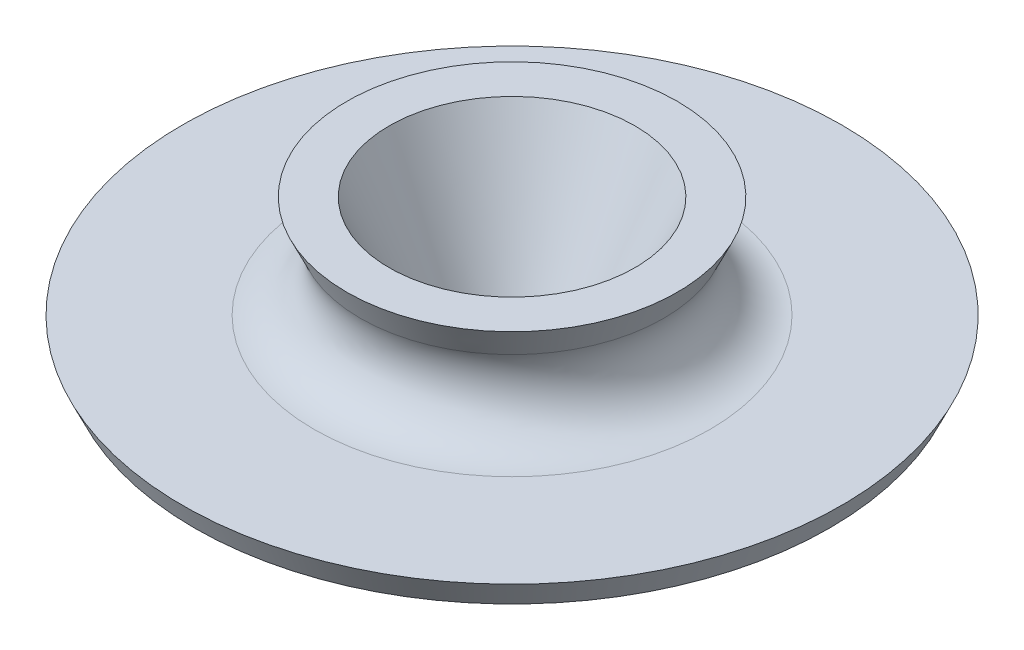
ISO-10303-21;
HEADER;
FILE_DESCRIPTION(('STEP AP214'),'2;1');
FILE_NAME('part.step','',(''),(''),'','','');
FILE_SCHEMA(('AUTOMOTIVE_DESIGN { 1 0 10303 214 1 1 1 1 }'));
ENDSEC;
DATA;
#1=APPLICATION_CONTEXT('core data for automotive mechanical design processes');
#2=APPLICATION_PROTOCOL_DEFINITION('international standard','automotive_design',2000,#1);
#3=PRODUCT_CONTEXT('',#1,'mechanical');
#4=PRODUCT('Part','Part','',(#3));
#5=PRODUCT_RELATED_PRODUCT_CATEGORY('part','',(#4));
#6=PRODUCT_DEFINITION_FORMATION('','',#4);
#7=PRODUCT_DEFINITION_CONTEXT('part definition',#1,'design');
#8=PRODUCT_DEFINITION('design','',#6,#7);
#9=PRODUCT_DEFINITION_SHAPE('','',#8);
#10=(LENGTH_UNIT() NAMED_UNIT(*) SI_UNIT(.MILLI.,.METRE.));
#11=(NAMED_UNIT(*) PLANE_ANGLE_UNIT() SI_UNIT($,.RADIAN.));
#12=(NAMED_UNIT(*) SI_UNIT($,.STERADIAN.) SOLID_ANGLE_UNIT());
#13=UNCERTAINTY_MEASURE_WITH_UNIT(LENGTH_MEASURE(1.E-05),#10,'distance_accuracy_value','');
#14=(GEOMETRIC_REPRESENTATION_CONTEXT(3) GLOBAL_UNCERTAINTY_ASSIGNED_CONTEXT((#13)) GLOBAL_UNIT_ASSIGNED_CONTEXT((#10,
#11,#12)) REPRESENTATION_CONTEXT('',''));
#15=CARTESIAN_POINT('',(0.,0.,0.));
#16=DIRECTION('',(0.,0.,1.));
#17=DIRECTION('',(1.,0.,0.));
#18=AXIS2_PLACEMENT_3D('',#15,#16,#17);
#19=CARTESIAN_POINT('',(-12.7,-0.571707157262167,0.));
#20=DIRECTION('',(0.,1.,0.));
#21=DIRECTION('',(0.,0.,1.));
#22=AXIS2_PLACEMENT_3D('',#19,#20,#21);
#23=PLANE('',#22);
#24=CARTESIAN_POINT('',(0.,-0.571707157262167,0.));
#25=DIRECTION('',(0.,-1.,0.));
#26=DIRECTION('',(0.,0.,-1.));
#27=AXIS2_PLACEMENT_3D('',#24,#25,#26);
#28=CIRCLE('',#27,12.7);
#29=CARTESIAN_POINT('',(0.,-0.571707157262167,-12.7));
#30=VERTEX_POINT('',#29);
#31=EDGE_CURVE('E86',#30,#30,#28,.T.);
#32=ORIENTED_EDGE('',*,*,#31,.F.);
#33=EDGE_LOOP('',(#32));
#34=FACE_BOUND('',#33,.T.);
#35=CARTESIAN_POINT('',(0.,-0.571707157262167,0.));
#36=DIRECTION('',(0.,-1.,0.));
#37=DIRECTION('',(0.,0.,-1.));
#38=AXIS2_PLACEMENT_3D('',#35,#36,#37);
#39=CIRCLE('',#38,19.05);
#40=CARTESIAN_POINT('',(0.,-0.571707157262167,-19.05));
#41=VERTEX_POINT('',#40);
#42=EDGE_CURVE('E66',#41,#41,#39,.T.);
#43=ORIENTED_EDGE('',*,*,#42,.T.);
#44=EDGE_LOOP('',(#43));
#45=FACE_BOUND('',#44,.T.);
#46=ADVANCED_FACE('F42',(#34,#45),#23,.F.);
#47=CARTESIAN_POINT('',(0.,5.77829284273783,0.));
#48=DIRECTION('',(0.,1.,0.));
#49=DIRECTION('',(0.,0.,1.));
#50=AXIS2_PLACEMENT_3D('',#47,#48,#49);
#51=CONICAL_SURFACE('',#50,22.0110536292842,0.436332312998584);
#52=CARTESIAN_POINT('',(0.,4.31174322755921,0.));
#53=DIRECTION('',(0.,1.,0.));
#54=DIRECTION('',(0.,0.,1.));
#55=AXIS2_PLACEMENT_3D('',#52,#53,#54);
#56=CIRCLE('',#55,21.3271903126622);
#57=CARTESIAN_POINT('',(0.,4.31174322755921,21.3271903126622));
#58=VERTEX_POINT('',#57);
#59=EDGE_CURVE('E50',#58,#58,#56,.F.);
#60=ORIENTED_EDGE('',*,*,#59,.T.);
#61=EDGE_LOOP('',(#60));
#62=FACE_BOUND('',#61,.T.);
#63=ORIENTED_EDGE('',*,*,#42,.F.);
#64=EDGE_LOOP('',(#63));
#65=FACE_BOUND('',#64,.T.);
#66=ADVANCED_FACE('F95',(#62,#65),#51,.T.);
#67=CARTESIAN_POINT('',(-22.0110536292842,5.77829284273783,0.));
#68=DIRECTION('',(0.,1.,0.));
#69=DIRECTION('',(0.,0.,1.));
#70=AXIS2_PLACEMENT_3D('',#67,#68,#69);
#71=PLANE('',#70);
#72=CARTESIAN_POINT('',(0.,5.77829284273783,0.));
#73=DIRECTION('',(0.,1.,0.));
#74=DIRECTION('',(0.,0.,1.));
#75=AXIS2_PLACEMENT_3D('',#72,#73,#74);
#76=CIRCLE('',#75,23.6292120917353);
#77=CARTESIAN_POINT('',(0.,5.77829284273783,23.6292120917353));
#78=VERTEX_POINT('',#77);
#79=EDGE_CURVE('E10',#78,#78,#76,.T.);
#80=ORIENTED_EDGE('',*,*,#79,.T.);
#81=EDGE_LOOP('',(#80));
#82=FACE_BOUND('',#81,.T.);
#83=CARTESIAN_POINT('',(0.,5.77829284273782,0.));
#84=DIRECTION('',(0.,-1.,0.));
#85=DIRECTION('',(0.,0.,-1.));
#86=AXIS2_PLACEMENT_3D('',#83,#84,#85);
#87=CIRCLE('',#86,78.7191016979907);
#88=CARTESIAN_POINT('',(0.,5.77829284273782,-78.7191016979907));
#89=VERTEX_POINT('',#88);
#90=EDGE_CURVE('E70',#89,#89,#87,.T.);
#91=ORIENTED_EDGE('',*,*,#90,.T.);
#92=EDGE_LOOP('',(#91));
#93=FACE_BOUND('',#92,.T.);
#94=ADVANCED_FACE('F100',(#82,#93),#71,.F.);
#95=CARTESIAN_POINT('',(0.,12.1282928427378,0.));
#96=DIRECTION('',(0.,1.,0.));
#97=DIRECTION('',(0.,0.,1.));
#98=AXIS2_PLACEMENT_3D('',#95,#96,#97);
#99=CONICAL_SURFACE('',#98,81.680155327275,0.436332312998584);
#100=ORIENTED_EDGE('',*,*,#90,.F.);
#101=EDGE_LOOP('',(#100));
#102=FACE_BOUND('',#101,.T.);
#103=CARTESIAN_POINT('',(0.,12.1282928427378,0.));
#104=DIRECTION('',(0.,-1.,0.));
#105=DIRECTION('',(0.,0.,-1.));
#106=AXIS2_PLACEMENT_3D('',#103,#104,#105);
#107=CIRCLE('',#106,81.680155327275);
#108=CARTESIAN_POINT('',(0.,12.1282928427378,-81.680155327275));
#109=VERTEX_POINT('',#108);
#110=EDGE_CURVE('E74',#109,#109,#107,.T.);
#111=ORIENTED_EDGE('',*,*,#110,.T.);
#112=EDGE_LOOP('',(#111));
#113=FACE_BOUND('',#112,.T.);
#114=ADVANCED_FACE('F106',(#102,#113),#99,.T.);
#115=CARTESIAN_POINT('',(-50.1906713193774,12.1282928427378,0.));
#116=DIRECTION('',(0.,-1.,0.));
#117=DIRECTION('',(0.,0.,-1.));
#118=AXIS2_PLACEMENT_3D('',#115,#116,#117);
#119=PLANE('',#118);
#120=CARTESIAN_POINT('',(0.,12.1282928427378,0.));
#121=DIRECTION('',(0.,-1.,0.));
#122=DIRECTION('',(0.,0.,-1.));
#123=AXIS2_PLACEMENT_3D('',#120,#121,#122);
#124=CIRCLE('',#123,49.0667887660784);
#125=CARTESIAN_POINT('',(0.,12.1282928427378,-49.0667887660784));
#126=VERTEX_POINT('',#125);
#127=EDGE_CURVE('E60',#126,#126,#124,.T.);
#128=ORIENTED_EDGE('',*,*,#127,.T.);
#129=EDGE_LOOP('',(#128));
#130=FACE_BOUND('',#129,.T.);
#131=ORIENTED_EDGE('',*,*,#110,.F.);
#132=EDGE_LOOP('',(#131));
#133=FACE_BOUND('',#132,.T.);
#134=ADVANCED_FACE('F124',(#130,#133),#119,.F.);
#135=CARTESIAN_POINT('',(0.,37.5282928427378,0.));
#136=DIRECTION('',(0.,1.,0.));
#137=DIRECTION('',(0.,0.,1.));
#138=AXIS2_PLACEMENT_3D('',#135,#136,#137);
#139=CONICAL_SURFACE('',#138,40.9759964538233,0.436332312998584);
#140=CARTESIAN_POINT('',(0.,30.1955447668447,0.));
#141=DIRECTION('',(0.,1.,0.));
#142=DIRECTION('',(0.,0.,1.));
#143=AXIS2_PLACEMENT_3D('',#140,#141,#142);
#144=CIRCLE('',#143,37.556679870713);
#145=CARTESIAN_POINT('',(0.,30.1955447668447,37.556679870713));
#146=VERTEX_POINT('',#145);
#147=EDGE_CURVE('E55',#146,#146,#144,.T.);
#148=ORIENTED_EDGE('',*,*,#147,.T.);
#149=EDGE_LOOP('',(#148));
#150=FACE_BOUND('',#149,.T.);
#151=CARTESIAN_POINT('',(0.,37.5282928427378,0.));
#152=DIRECTION('',(0.,-1.,0.));
#153=DIRECTION('',(0.,0.,-1.));
#154=AXIS2_PLACEMENT_3D('',#151,#152,#153);
#155=CIRCLE('',#154,40.9759964538233);
#156=CARTESIAN_POINT('',(0.,37.5282928427378,-40.9759964538233));
#157=VERTEX_POINT('',#156);
#158=EDGE_CURVE('E78',#157,#157,#155,.T.);
#159=ORIENTED_EDGE('',*,*,#158,.T.);
#160=EDGE_LOOP('',(#159));
#161=FACE_BOUND('',#160,.T.);
#162=ADVANCED_FACE('F127',(#150,#161),#139,.T.);
#163=CARTESIAN_POINT('',(-40.9759964538233,37.5282928427378,0.));
#164=DIRECTION('',(0.,-1.,0.));
#165=DIRECTION('',(0.,0.,-1.));
#166=AXIS2_PLACEMENT_3D('',#163,#164,#165);
#167=PLANE('',#166);
#168=ORIENTED_EDGE('',*,*,#158,.F.);
#169=EDGE_LOOP('',(#168));
#170=FACE_BOUND('',#169,.T.);
#171=CARTESIAN_POINT('',(0.,37.5282928427378,0.));
#172=DIRECTION('',(0.,-1.,0.));
#173=DIRECTION('',(0.,0.,-1.));
#174=AXIS2_PLACEMENT_3D('',#171,#172,#173);
#175=CIRCLE('',#174,30.4663217757055);
#176=CARTESIAN_POINT('',(0.,37.5282928427378,-30.4663217757055));
#177=VERTEX_POINT('',#176);
#178=EDGE_CURVE('E82',#177,#177,#175,.T.);
#179=ORIENTED_EDGE('',*,*,#178,.T.);
#180=EDGE_LOOP('',(#179));
#181=FACE_BOUND('',#180,.T.);
#182=ADVANCED_FACE('F117',(#170,#181),#167,.F.);
#183=CARTESIAN_POINT('',(0.,-0.571707157262167,0.));
#184=DIRECTION('',(0.,1.,0.));
#185=DIRECTION('',(0.,0.,1.));
#186=AXIS2_PLACEMENT_3D('',#183,#184,#185);
#187=CONICAL_SURFACE('',#186,12.7,0.436332312998584);
#188=ORIENTED_EDGE('',*,*,#178,.F.);
#189=EDGE_LOOP('',(#188));
#190=FACE_BOUND('',#189,.T.);
#191=ORIENTED_EDGE('',*,*,#31,.T.);
#192=EDGE_LOOP('',(#191));
#193=FACE_BOUND('',#192,.T.);
#194=ADVANCED_FACE('F91',(#190,#193),#187,.F.);
#195=CARTESIAN_POINT('',(0.,24.8282928427378,0.));
#196=DIRECTION('',(0.,-1.,0.));
#197=DIRECTION('',(0.,0.,-1.));
#198=AXIS2_PLACEMENT_3D('',#195,#196,#197);
#199=TOROIDAL_SURFACE('',#198,49.0667887660784,12.7);
#200=ORIENTED_EDGE('',*,*,#147,.F.);
#201=EDGE_LOOP('',(#200));
#202=FACE_BOUND('',#201,.T.);
#203=ORIENTED_EDGE('',*,*,#127,.F.);
#204=EDGE_LOOP('',(#203));
#205=FACE_BOUND('',#204,.T.);
#206=ADVANCED_FACE('F109',(#202,#205),#199,.F.);
#207=CARTESIAN_POINT('',(0.,3.23829284273783,0.));
#208=DIRECTION('',(0.,1.,0.));
#209=DIRECTION('',(0.,0.,1.));
#210=AXIS2_PLACEMENT_3D('',#207,#208,#209);
#211=TOROIDAL_SURFACE('',#210,23.6292120917353,2.54);
#212=ORIENTED_EDGE('',*,*,#79,.F.);
#213=EDGE_LOOP('',(#212));
#214=FACE_BOUND('',#213,.T.);
#215=ORIENTED_EDGE('',*,*,#59,.F.);
#216=EDGE_LOOP('',(#215));
#217=FACE_BOUND('',#216,.T.);
#218=ADVANCED_FACE('F44',(#214,#217),#211,.F.);
#219=CLOSED_SHELL('',(#46,#66,#94,#114,#134,#162,#182,#194,#206,#218));
#220=MANIFOLD_SOLID_BREP('B2',#219);
#221=ADVANCED_BREP_SHAPE_REPRESENTATION('',(#18,#220),#14);
#222=SHAPE_DEFINITION_REPRESENTATION(#9,#221);
ENDSEC;
END-ISO-10303-21;
